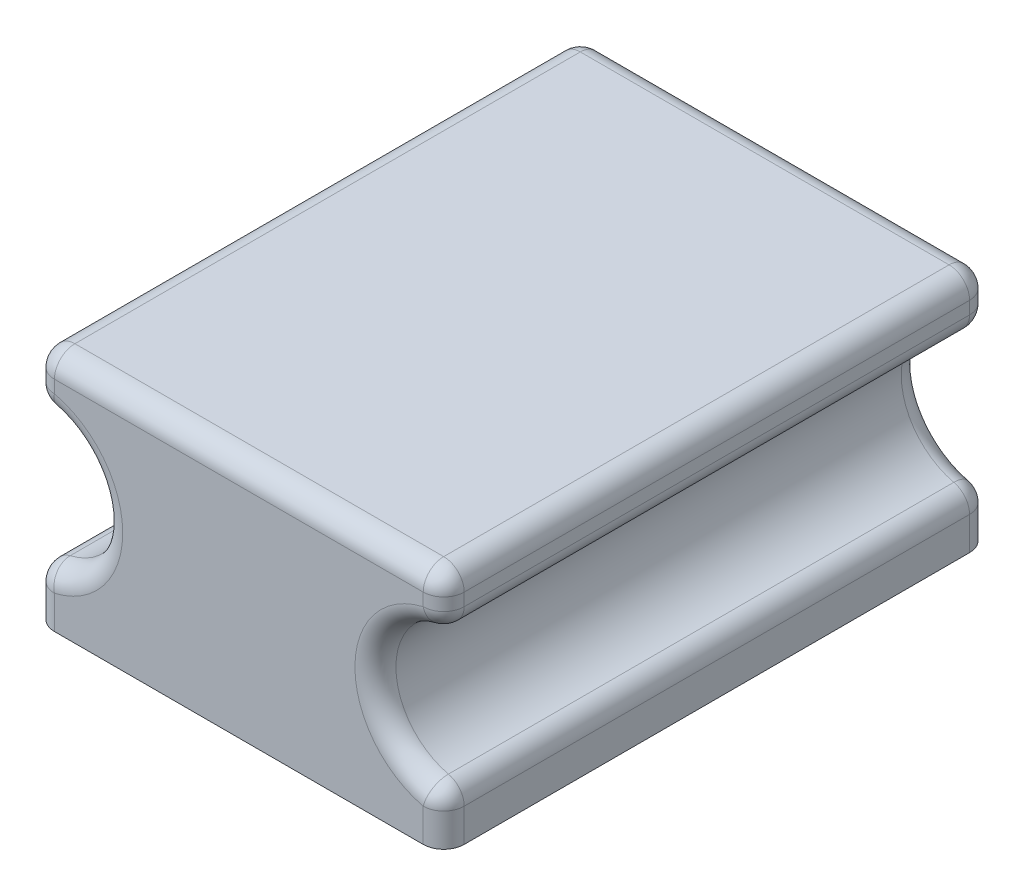
ISO-10303-21;
HEADER;
FILE_DESCRIPTION(('STEP AP214'),'2;1');
FILE_NAME('part.step','',(''),(''),'','','');
FILE_SCHEMA(('AUTOMOTIVE_DESIGN { 1 0 10303 214 1 1 1 1 }'));
ENDSEC;
DATA;
#1=APPLICATION_CONTEXT('core data for automotive mechanical design processes');
#2=APPLICATION_PROTOCOL_DEFINITION('international standard','automotive_design',2000,#1);
#3=PRODUCT_CONTEXT('',#1,'mechanical');
#4=PRODUCT('Part','Part','',(#3));
#5=PRODUCT_RELATED_PRODUCT_CATEGORY('part','',(#4));
#6=PRODUCT_DEFINITION_FORMATION('','',#4);
#7=PRODUCT_DEFINITION_CONTEXT('part definition',#1,'design');
#8=PRODUCT_DEFINITION('design','',#6,#7);
#9=PRODUCT_DEFINITION_SHAPE('','',#8);
#10=(LENGTH_UNIT() NAMED_UNIT(*) SI_UNIT(.MILLI.,.METRE.));
#11=(NAMED_UNIT(*) PLANE_ANGLE_UNIT() SI_UNIT($,.RADIAN.));
#12=(NAMED_UNIT(*) SI_UNIT($,.STERADIAN.) SOLID_ANGLE_UNIT());
#13=UNCERTAINTY_MEASURE_WITH_UNIT(LENGTH_MEASURE(1.E-05),#10,'distance_accuracy_value','');
#14=(GEOMETRIC_REPRESENTATION_CONTEXT(3) GLOBAL_UNCERTAINTY_ASSIGNED_CONTEXT((#13)) GLOBAL_UNIT_ASSIGNED_CONTEXT((#10,
#11,#12)) REPRESENTATION_CONTEXT('',''));
#15=CARTESIAN_POINT('',(0.,0.,0.));
#16=DIRECTION('',(0.,0.,1.));
#17=DIRECTION('',(1.,0.,0.));
#18=AXIS2_PLACEMENT_3D('',#15,#16,#17);
#19=CARTESIAN_POINT('',(-30.,7.5,40.));
#20=DIRECTION('',(1.,0.,0.));
#21=DIRECTION('',(0.,0.,-1.));
#22=AXIS2_PLACEMENT_3D('',#19,#20,#21);
#23=PLANE('',#22);
#24=DIRECTION('',(0.,0.,-1.));
#25=VECTOR('',#24,1.);
#26=CARTESIAN_POINT('',(-30.,4.85088935932648,40.));
#27=LINE('',#26,#25);
#28=CARTESIAN_POINT('',(-30.,4.85088935932648,37.));
#29=VERTEX_POINT('',#28);
#30=CARTESIAN_POINT('',(-30.,4.85088935932648,-37.));
#31=VERTEX_POINT('',#30);
#32=EDGE_CURVE('E224',#29,#31,#27,.T.);
#33=ORIENTED_EDGE('',*,*,#32,.T.);
#34=DIRECTION('',(0.,-1.,0.));
#35=VECTOR('',#34,1.);
#36=CARTESIAN_POINT('',(-30.,7.5,-37.));
#37=LINE('',#36,#35);
#38=CARTESIAN_POINT('',(-30.,0.,-37.));
#39=VERTEX_POINT('',#38);
#40=EDGE_CURVE('E296',#31,#39,#37,.T.);
#41=ORIENTED_EDGE('',*,*,#40,.T.);
#42=DIRECTION('',(0.,0.,-1.));
#43=VECTOR('',#42,1.);
#44=CARTESIAN_POINT('',(-30.,0.,40.));
#45=LINE('',#44,#43);
#46=CARTESIAN_POINT('',(-30.,0.,37.));
#47=VERTEX_POINT('',#46);
#48=EDGE_CURVE('E416',#47,#39,#45,.T.);
#49=ORIENTED_EDGE('',*,*,#48,.F.);
#50=DIRECTION('',(0.,-1.,0.));
#51=VECTOR('',#50,1.);
#52=CARTESIAN_POINT('',(-30.,4.85088935932648,37.));
#53=LINE('',#52,#51);
#54=EDGE_CURVE('E294',#47,#29,#53,.F.);
#55=ORIENTED_EDGE('',*,*,#54,.T.);
#56=EDGE_LOOP('',(#33,#41,#49,#55));
#57=FACE_BOUND('',#56,.T.);
#58=ADVANCED_FACE('F37',(#57),#23,.F.);
#59=CARTESIAN_POINT('',(-30.,0.,40.));
#60=DIRECTION('',(0.,1.,0.));
#61=DIRECTION('',(0.,0.,1.));
#62=AXIS2_PLACEMENT_3D('',#59,#60,#61);
#63=PLANE('',#62);
#64=DIRECTION('',(1.,0.,0.));
#65=VECTOR('',#64,1.);
#66=CARTESIAN_POINT('',(-30.,0.,-40.));
#67=LINE('',#66,#65);
#68=CARTESIAN_POINT('',(-27.,0.,-40.));
#69=VERTEX_POINT('',#68);
#70=CARTESIAN_POINT('',(27.,0.,-40.));
#71=VERTEX_POINT('',#70);
#72=EDGE_CURVE('E363',#69,#71,#67,.T.);
#73=ORIENTED_EDGE('',*,*,#72,.T.);
#74=CARTESIAN_POINT('',(27.,0.,-37.));
#75=DIRECTION('',(0.,1.,0.));
#76=DIRECTION('',(0.,0.,1.));
#77=AXIS2_PLACEMENT_3D('',#74,#75,#76);
#78=CIRCLE('',#77,3.);
#79=CARTESIAN_POINT('',(30.,0.,-37.));
#80=VERTEX_POINT('',#79);
#81=EDGE_CURVE('E276',#71,#80,#78,.F.);
#82=ORIENTED_EDGE('',*,*,#81,.T.);
#83=DIRECTION('',(0.,0.,-1.));
#84=VECTOR('',#83,1.);
#85=CARTESIAN_POINT('',(30.,0.,40.));
#86=LINE('',#85,#84);
#87=CARTESIAN_POINT('',(30.,0.,37.));
#88=VERTEX_POINT('',#87);
#89=EDGE_CURVE('E218',#88,#80,#86,.T.);
#90=ORIENTED_EDGE('',*,*,#89,.F.);
#91=CARTESIAN_POINT('',(27.,0.,37.));
#92=DIRECTION('',(0.,1.,0.));
#93=DIRECTION('',(0.,0.,1.));
#94=AXIS2_PLACEMENT_3D('',#91,#92,#93);
#95=CIRCLE('',#94,3.);
#96=CARTESIAN_POINT('',(27.,0.,40.));
#97=VERTEX_POINT('',#96);
#98=EDGE_CURVE('E272',#88,#97,#95,.F.);
#99=ORIENTED_EDGE('',*,*,#98,.T.);
#100=DIRECTION('',(1.,0.,0.));
#101=VECTOR('',#100,1.);
#102=CARTESIAN_POINT('',(-30.,0.,40.));
#103=LINE('',#102,#101);
#104=CARTESIAN_POINT('',(-27.,0.,40.));
#105=VERTEX_POINT('',#104);
#106=EDGE_CURVE('E408',#105,#97,#103,.T.);
#107=ORIENTED_EDGE('',*,*,#106,.F.);
#108=CARTESIAN_POINT('',(-27.,0.,37.));
#109=DIRECTION('',(0.,1.,0.));
#110=DIRECTION('',(0.,0.,1.));
#111=AXIS2_PLACEMENT_3D('',#108,#109,#110);
#112=CIRCLE('',#111,3.);
#113=EDGE_CURVE('E270',#105,#47,#112,.F.);
#114=ORIENTED_EDGE('',*,*,#113,.T.);
#115=ORIENTED_EDGE('',*,*,#48,.T.);
#116=CARTESIAN_POINT('',(-27.,0.,-37.));
#117=DIRECTION('',(0.,1.,0.));
#118=DIRECTION('',(0.,0.,1.));
#119=AXIS2_PLACEMENT_3D('',#116,#117,#118);
#120=CIRCLE('',#119,3.);
#121=EDGE_CURVE('E274',#39,#69,#120,.F.);
#122=ORIENTED_EDGE('',*,*,#121,.T.);
#123=EDGE_LOOP('',(#73,#82,#90,#99,#107,#114,#115,#122));
#124=FACE_BOUND('',#123,.T.);
#125=ADVANCED_FACE('F411',(#124),#63,.F.);
#126=CARTESIAN_POINT('',(30.,0.,40.));
#127=DIRECTION('',(-1.,0.,0.));
#128=DIRECTION('',(0.,0.,1.));
#129=AXIS2_PLACEMENT_3D('',#126,#127,#128);
#130=PLANE('',#129);
#131=ORIENTED_EDGE('',*,*,#89,.T.);
#132=DIRECTION('',(0.,1.,0.));
#133=VECTOR('',#132,1.);
#134=CARTESIAN_POINT('',(30.,0.,-37.));
#135=LINE('',#134,#133);
#136=CARTESIAN_POINT('',(30.,4.85088935932648,-37.));
#137=VERTEX_POINT('',#136);
#138=EDGE_CURVE('E196',#80,#137,#135,.T.);
#139=ORIENTED_EDGE('',*,*,#138,.T.);
#140=DIRECTION('',(0.,0.,-1.));
#141=VECTOR('',#140,1.);
#142=CARTESIAN_POINT('',(30.,4.85088935932648,40.));
#143=LINE('',#142,#141);
#144=CARTESIAN_POINT('',(30.,4.85088935932648,37.));
#145=VERTEX_POINT('',#144);
#146=EDGE_CURVE('E216',#137,#145,#143,.F.);
#147=ORIENTED_EDGE('',*,*,#146,.T.);
#148=DIRECTION('',(0.,1.,0.));
#149=VECTOR('',#148,1.);
#150=CARTESIAN_POINT('',(30.,0.,37.));
#151=LINE('',#150,#149);
#152=EDGE_CURVE('E220',#145,#88,#151,.F.);
#153=ORIENTED_EDGE('',*,*,#152,.T.);
#154=EDGE_LOOP('',(#131,#139,#147,#153));
#155=FACE_BOUND('',#154,.T.);
#156=ADVANCED_FACE('F215',(#155),#130,.F.);
#157=CARTESIAN_POINT('',(30.,17.5,40.));
#158=DIRECTION('',(0.,0.,-1.));
#159=DIRECTION('',(-1.,0.,0.));
#160=AXIS2_PLACEMENT_3D('',#157,#158,#159);
#161=CYLINDRICAL_SURFACE('',#160,10.);
#162=DIRECTION('',(0.,0.,-1.));
#163=VECTOR('',#162,1.);
#164=CARTESIAN_POINT('',(27.6923076923077,7.7699148917896,40.));
#165=LINE('',#164,#163);
#166=CARTESIAN_POINT('',(27.6923076923077,7.7699148917896,37.));
#167=VERTEX_POINT('',#166);
#168=CARTESIAN_POINT('',(27.6923076923077,7.7699148917896,-37.));
#169=VERTEX_POINT('',#168);
#170=EDGE_CURVE('E225',#167,#169,#165,.T.);
#171=ORIENTED_EDGE('',*,*,#170,.T.);
#172=CARTESIAN_POINT('',(30.,17.5,-37.));
#173=DIRECTION('',(0.,0.,1.));
#174=DIRECTION('',(1.,0.,0.));
#175=AXIS2_PLACEMENT_3D('',#172,#173,#174);
#176=CIRCLE('',#175,10.);
#177=CARTESIAN_POINT('',(27.6923076923077,27.2300851082104,-37.));
#178=VERTEX_POINT('',#177);
#179=EDGE_CURVE('E280',#169,#178,#176,.F.);
#180=ORIENTED_EDGE('',*,*,#179,.T.);
#181=DIRECTION('',(0.,0.,-1.));
#182=VECTOR('',#181,1.);
#183=CARTESIAN_POINT('',(27.6923076923077,27.2300851082104,40.));
#184=LINE('',#183,#182);
#185=CARTESIAN_POINT('',(27.6923076923077,27.2300851082104,37.));
#186=VERTEX_POINT('',#185);
#187=EDGE_CURVE('E230',#178,#186,#184,.F.);
#188=ORIENTED_EDGE('',*,*,#187,.T.);
#189=CARTESIAN_POINT('',(30.,17.5,37.));
#190=DIRECTION('',(0.,0.,1.));
#191=DIRECTION('',(1.,0.,0.));
#192=AXIS2_PLACEMENT_3D('',#189,#190,#191);
#193=CIRCLE('',#192,10.);
#194=EDGE_CURVE('E209',#186,#167,#193,.T.);
#195=ORIENTED_EDGE('',*,*,#194,.T.);
#196=EDGE_LOOP('',(#171,#180,#188,#195));
#197=FACE_BOUND('',#196,.T.);
#198=ADVANCED_FACE('F424',(#197),#161,.F.);
#199=CARTESIAN_POINT('',(30.,27.5,40.));
#200=DIRECTION('',(-1.,0.,0.));
#201=DIRECTION('',(0.,0.,1.));
#202=AXIS2_PLACEMENT_3D('',#199,#200,#201);
#203=PLANE('',#202);
#204=DIRECTION('',(0.,0.,-1.));
#205=VECTOR('',#204,1.);
#206=CARTESIAN_POINT('',(30.,30.1491106406735,40.));
#207=LINE('',#206,#205);
#208=CARTESIAN_POINT('',(30.,30.1491106406735,37.));
#209=VERTEX_POINT('',#208);
#210=CARTESIAN_POINT('',(30.,30.1491106406735,-37.));
#211=VERTEX_POINT('',#210);
#212=EDGE_CURVE('E248',#209,#211,#207,.T.);
#213=ORIENTED_EDGE('',*,*,#212,.T.);
#214=DIRECTION('',(0.,1.,0.));
#215=VECTOR('',#214,1.);
#216=CARTESIAN_POINT('',(30.,27.5,-37.));
#217=LINE('',#216,#215);
#218=CARTESIAN_POINT('',(30.,32.,-37.));
#219=VERTEX_POINT('',#218);
#220=EDGE_CURVE('E288',#211,#219,#217,.T.);
#221=ORIENTED_EDGE('',*,*,#220,.T.);
#222=DIRECTION('',(0.,0.,-1.));
#223=VECTOR('',#222,1.);
#224=CARTESIAN_POINT('',(30.,32.,40.));
#225=LINE('',#224,#223);
#226=CARTESIAN_POINT('',(30.,32.,37.));
#227=VERTEX_POINT('',#226);
#228=EDGE_CURVE('E245',#219,#227,#225,.F.);
#229=ORIENTED_EDGE('',*,*,#228,.T.);
#230=DIRECTION('',(0.,1.,0.));
#231=VECTOR('',#230,1.);
#232=CARTESIAN_POINT('',(30.,30.1491106406735,37.));
#233=LINE('',#232,#231);
#234=EDGE_CURVE('E286',#227,#209,#233,.F.);
#235=ORIENTED_EDGE('',*,*,#234,.T.);
#236=EDGE_LOOP('',(#213,#221,#229,#235));
#237=FACE_BOUND('',#236,.T.);
#238=ADVANCED_FACE('F541',(#237),#203,.F.);
#239=CARTESIAN_POINT('',(30.,35.,40.));
#240=DIRECTION('',(0.,-1.,0.));
#241=DIRECTION('',(0.,0.,-1.));
#242=AXIS2_PLACEMENT_3D('',#239,#240,#241);
#243=PLANE('',#242);
#244=DIRECTION('',(0.,0.,-1.));
#245=VECTOR('',#244,1.);
#246=CARTESIAN_POINT('',(27.,35.,40.));
#247=LINE('',#246,#245);
#248=CARTESIAN_POINT('',(27.,35.,37.));
#249=VERTEX_POINT('',#248);
#250=CARTESIAN_POINT('',(27.,35.,-37.));
#251=VERTEX_POINT('',#250);
#252=EDGE_CURVE('E251',#249,#251,#247,.T.);
#253=ORIENTED_EDGE('',*,*,#252,.T.);
#254=DIRECTION('',(-1.,0.,0.));
#255=VECTOR('',#254,1.);
#256=CARTESIAN_POINT('',(30.,35.,-37.));
#257=LINE('',#256,#255);
#258=CARTESIAN_POINT('',(-27.,35.,-37.));
#259=VERTEX_POINT('',#258);
#260=EDGE_CURVE('E11',#251,#259,#257,.T.);
#261=ORIENTED_EDGE('',*,*,#260,.T.);
#262=DIRECTION('',(0.,0.,-1.));
#263=VECTOR('',#262,1.);
#264=CARTESIAN_POINT('',(-27.,35.,40.));
#265=LINE('',#264,#263);
#266=CARTESIAN_POINT('',(-27.,35.,37.));
#267=VERTEX_POINT('',#266);
#268=EDGE_CURVE('E254',#259,#267,#265,.F.);
#269=ORIENTED_EDGE('',*,*,#268,.T.);
#270=DIRECTION('',(-1.,0.,0.));
#271=VECTOR('',#270,1.);
#272=CARTESIAN_POINT('',(27.,35.,37.));
#273=LINE('',#272,#271);
#274=EDGE_CURVE('E46',#267,#249,#273,.F.);
#275=ORIENTED_EDGE('',*,*,#274,.T.);
#276=EDGE_LOOP('',(#253,#261,#269,#275));
#277=FACE_BOUND('',#276,.T.);
#278=ADVANCED_FACE('F551',(#277),#243,.F.);
#279=CARTESIAN_POINT('',(-30.,35.,40.));
#280=DIRECTION('',(1.,0.,0.));
#281=DIRECTION('',(0.,0.,-1.));
#282=AXIS2_PLACEMENT_3D('',#279,#280,#281);
#283=PLANE('',#282);
#284=DIRECTION('',(0.,0.,-1.));
#285=VECTOR('',#284,1.);
#286=CARTESIAN_POINT('',(-30.,32.,40.));
#287=LINE('',#286,#285);
#288=CARTESIAN_POINT('',(-30.,32.,37.));
#289=VERTEX_POINT('',#288);
#290=CARTESIAN_POINT('',(-30.,32.,-37.));
#291=VERTEX_POINT('',#290);
#292=EDGE_CURVE('E239',#289,#291,#287,.T.);
#293=ORIENTED_EDGE('',*,*,#292,.T.);
#294=DIRECTION('',(0.,-1.,0.));
#295=VECTOR('',#294,1.);
#296=CARTESIAN_POINT('',(-30.,35.,-37.));
#297=LINE('',#296,#295);
#298=CARTESIAN_POINT('',(-30.,30.1491106406735,-37.));
#299=VERTEX_POINT('',#298);
#300=EDGE_CURVE('E312',#291,#299,#297,.T.);
#301=ORIENTED_EDGE('',*,*,#300,.T.);
#302=DIRECTION('',(0.,0.,-1.));
#303=VECTOR('',#302,1.);
#304=CARTESIAN_POINT('',(-30.,30.1491106406735,40.));
#305=LINE('',#304,#303);
#306=CARTESIAN_POINT('',(-30.,30.1491106406735,37.));
#307=VERTEX_POINT('',#306);
#308=EDGE_CURVE('E242',#299,#307,#305,.F.);
#309=ORIENTED_EDGE('',*,*,#308,.T.);
#310=DIRECTION('',(0.,-1.,0.));
#311=VECTOR('',#310,1.);
#312=CARTESIAN_POINT('',(-30.,32.,37.));
#313=LINE('',#312,#311);
#314=EDGE_CURVE('E310',#307,#289,#313,.F.);
#315=ORIENTED_EDGE('',*,*,#314,.T.);
#316=EDGE_LOOP('',(#293,#301,#309,#315));
#317=FACE_BOUND('',#316,.T.);
#318=ADVANCED_FACE('F562',(#317),#283,.F.);
#319=CARTESIAN_POINT('',(-30.,17.5,40.));
#320=DIRECTION('',(0.,0.,-1.));
#321=DIRECTION('',(-1.,0.,0.));
#322=AXIS2_PLACEMENT_3D('',#319,#320,#321);
#323=CYLINDRICAL_SURFACE('',#322,10.);
#324=DIRECTION('',(0.,0.,-1.));
#325=VECTOR('',#324,1.);
#326=CARTESIAN_POINT('',(-27.6923076923077,27.2300851082104,40.));
#327=LINE('',#326,#325);
#328=CARTESIAN_POINT('',(-27.6923076923077,27.2300851082104,37.));
#329=VERTEX_POINT('',#328);
#330=CARTESIAN_POINT('',(-27.6923076923077,27.2300851082104,-37.));
#331=VERTEX_POINT('',#330);
#332=EDGE_CURVE('E228',#329,#331,#327,.T.);
#333=ORIENTED_EDGE('',*,*,#332,.T.);
#334=CARTESIAN_POINT('',(-30.,17.5,-37.));
#335=DIRECTION('',(0.,0.,1.));
#336=DIRECTION('',(1.,0.,0.));
#337=AXIS2_PLACEMENT_3D('',#334,#335,#336);
#338=CIRCLE('',#337,10.);
#339=CARTESIAN_POINT('',(-27.6923076923077,7.7699148917896,-37.));
#340=VERTEX_POINT('',#339);
#341=EDGE_CURVE('E304',#331,#340,#338,.F.);
#342=ORIENTED_EDGE('',*,*,#341,.T.);
#343=DIRECTION('',(0.,0.,-1.));
#344=VECTOR('',#343,1.);
#345=CARTESIAN_POINT('',(-27.6923076923077,7.7699148917896,40.));
#346=LINE('',#345,#344);
#347=CARTESIAN_POINT('',(-27.6923076923077,7.7699148917896,37.));
#348=VERTEX_POINT('',#347);
#349=EDGE_CURVE('E236',#340,#348,#346,.F.);
#350=ORIENTED_EDGE('',*,*,#349,.T.);
#351=CARTESIAN_POINT('',(-30.,17.5,37.));
#352=DIRECTION('',(0.,0.,1.));
#353=DIRECTION('',(1.,0.,0.));
#354=AXIS2_PLACEMENT_3D('',#351,#352,#353);
#355=CIRCLE('',#354,10.);
#356=EDGE_CURVE('E302',#348,#329,#355,.T.);
#357=ORIENTED_EDGE('',*,*,#356,.T.);
#358=EDGE_LOOP('',(#333,#342,#350,#357));
#359=FACE_BOUND('',#358,.T.);
#360=ADVANCED_FACE('F573',(#359),#323,.F.);
#361=CARTESIAN_POINT('',(30.,17.5,40.));
#362=DIRECTION('',(0.,0.,1.));
#363=DIRECTION('',(1.,0.,0.));
#364=AXIS2_PLACEMENT_3D('',#361,#362,#363);
#365=PLANE('',#364);
#366=ORIENTED_EDGE('',*,*,#106,.T.);
#367=DIRECTION('',(0.,1.,0.));
#368=VECTOR('',#367,1.);
#369=CARTESIAN_POINT('',(27.,4.85088935932648,40.));
#370=LINE('',#369,#368);
#371=CARTESIAN_POINT('',(27.,4.85088935932648,40.));
#372=VERTEX_POINT('',#371);
#373=EDGE_CURVE('E329',#97,#372,#370,.T.);
#374=ORIENTED_EDGE('',*,*,#373,.T.);
#375=CARTESIAN_POINT('',(30.,17.5,40.));
#376=DIRECTION('',(0.,0.,1.));
#377=DIRECTION('',(1.,0.,0.));
#378=AXIS2_PLACEMENT_3D('',#375,#376,#377);
#379=CIRCLE('',#378,13.);
#380=CARTESIAN_POINT('',(27.,30.1491106406735,40.));
#381=VERTEX_POINT('',#380);
#382=EDGE_CURVE('E62',#372,#381,#379,.F.);
#383=ORIENTED_EDGE('',*,*,#382,.T.);
#384=DIRECTION('',(0.,1.,0.));
#385=VECTOR('',#384,1.);
#386=CARTESIAN_POINT('',(27.,32.,40.));
#387=LINE('',#386,#385);
#388=CARTESIAN_POINT('',(27.,32.,40.));
#389=VERTEX_POINT('',#388);
#390=EDGE_CURVE('E326',#381,#389,#387,.T.);
#391=ORIENTED_EDGE('',*,*,#390,.T.);
#392=DIRECTION('',(-1.,0.,0.));
#393=VECTOR('',#392,1.);
#394=CARTESIAN_POINT('',(-27.,32.,40.));
#395=LINE('',#394,#393);
#396=CARTESIAN_POINT('',(-27.,32.,40.));
#397=VERTEX_POINT('',#396);
#398=EDGE_CURVE('E318',#389,#397,#395,.T.);
#399=ORIENTED_EDGE('',*,*,#398,.T.);
#400=DIRECTION('',(0.,-1.,0.));
#401=VECTOR('',#400,1.);
#402=CARTESIAN_POINT('',(-27.,30.1491106406735,40.));
#403=LINE('',#402,#401);
#404=CARTESIAN_POINT('',(-27.,30.1491106406735,40.));
#405=VERTEX_POINT('',#404);
#406=EDGE_CURVE('E320',#397,#405,#403,.T.);
#407=ORIENTED_EDGE('',*,*,#406,.T.);
#408=CARTESIAN_POINT('',(-30.,17.5,40.));
#409=DIRECTION('',(0.,0.,1.));
#410=DIRECTION('',(1.,0.,0.));
#411=AXIS2_PLACEMENT_3D('',#408,#409,#410);
#412=CIRCLE('',#411,13.);
#413=CARTESIAN_POINT('',(-27.,4.85088935932648,40.));
#414=VERTEX_POINT('',#413);
#415=EDGE_CURVE('E322',#405,#414,#412,.F.);
#416=ORIENTED_EDGE('',*,*,#415,.T.);
#417=DIRECTION('',(0.,-1.,0.));
#418=VECTOR('',#417,1.);
#419=CARTESIAN_POINT('',(-27.,0.,40.));
#420=LINE('',#419,#418);
#421=EDGE_CURVE('E324',#414,#105,#420,.T.);
#422=ORIENTED_EDGE('',*,*,#421,.T.);
#423=EDGE_LOOP('',(#366,#374,#383,#391,#399,#407,#416,#422));
#424=FACE_BOUND('',#423,.T.);
#425=ADVANCED_FACE('F407',(#424),#365,.T.);
#426=CARTESIAN_POINT('',(30.,17.5,-40.));
#427=DIRECTION('',(0.,0.,1.));
#428=DIRECTION('',(1.,0.,0.));
#429=AXIS2_PLACEMENT_3D('',#426,#427,#428);
#430=PLANE('',#429);
#431=CARTESIAN_POINT('',(30.,17.5,-40.));
#432=DIRECTION('',(0.,0.,1.));
#433=DIRECTION('',(1.,0.,0.));
#434=AXIS2_PLACEMENT_3D('',#431,#432,#433);
#435=CIRCLE('',#434,13.);
#436=CARTESIAN_POINT('',(27.,30.1491106406735,-40.));
#437=VERTEX_POINT('',#436);
#438=CARTESIAN_POINT('',(27.,4.85088935932648,-40.));
#439=VERTEX_POINT('',#438);
#440=EDGE_CURVE('E267',#437,#439,#435,.T.);
#441=ORIENTED_EDGE('',*,*,#440,.T.);
#442=DIRECTION('',(0.,1.,0.));
#443=VECTOR('',#442,1.);
#444=CARTESIAN_POINT('',(27.,17.5,-40.));
#445=LINE('',#444,#443);
#446=EDGE_CURVE('E197',#439,#71,#445,.F.);
#447=ORIENTED_EDGE('',*,*,#446,.T.);
#448=ORIENTED_EDGE('',*,*,#72,.F.);
#449=DIRECTION('',(0.,-1.,0.));
#450=VECTOR('',#449,1.);
#451=CARTESIAN_POINT('',(-27.,17.5,-40.));
#452=LINE('',#451,#450);
#453=CARTESIAN_POINT('',(-27.,4.85088935932648,-40.));
#454=VERTEX_POINT('',#453);
#455=EDGE_CURVE('E263',#69,#454,#452,.F.);
#456=ORIENTED_EDGE('',*,*,#455,.T.);
#457=CARTESIAN_POINT('',(-30.,17.5,-40.));
#458=DIRECTION('',(0.,0.,1.));
#459=DIRECTION('',(1.,0.,0.));
#460=AXIS2_PLACEMENT_3D('',#457,#458,#459);
#461=CIRCLE('',#460,13.);
#462=CARTESIAN_POINT('',(-27.,30.1491106406735,-40.));
#463=VERTEX_POINT('',#462);
#464=EDGE_CURVE('E261',#454,#463,#461,.T.);
#465=ORIENTED_EDGE('',*,*,#464,.T.);
#466=DIRECTION('',(0.,-1.,0.));
#467=VECTOR('',#466,1.);
#468=CARTESIAN_POINT('',(-27.,17.5,-40.));
#469=LINE('',#468,#467);
#470=CARTESIAN_POINT('',(-27.,32.,-40.));
#471=VERTEX_POINT('',#470);
#472=EDGE_CURVE('E259',#463,#471,#469,.F.);
#473=ORIENTED_EDGE('',*,*,#472,.T.);
#474=DIRECTION('',(-1.,0.,0.));
#475=VECTOR('',#474,1.);
#476=CARTESIAN_POINT('',(30.,32.,-40.));
#477=LINE('',#476,#475);
#478=CARTESIAN_POINT('',(27.,32.,-40.));
#479=VERTEX_POINT('',#478);
#480=EDGE_CURVE('E219',#471,#479,#477,.F.);
#481=ORIENTED_EDGE('',*,*,#480,.T.);
#482=DIRECTION('',(0.,1.,0.));
#483=VECTOR('',#482,1.);
#484=CARTESIAN_POINT('',(27.,17.5,-40.));
#485=LINE('',#484,#483);
#486=EDGE_CURVE('E265',#479,#437,#485,.F.);
#487=ORIENTED_EDGE('',*,*,#486,.T.);
#488=EDGE_LOOP('',(#441,#447,#448,#456,#465,#473,#481,#487));
#489=FACE_BOUND('',#488,.T.);
#490=ADVANCED_FACE('F459',(#489),#430,.F.);
#491=CARTESIAN_POINT('',(27.,4.85088935932648,40.));
#492=DIRECTION('',(0.,0.,-1.));
#493=DIRECTION('',(-1.,0.,0.));
#494=AXIS2_PLACEMENT_3D('',#491,#492,#493);
#495=CYLINDRICAL_SURFACE('',#494,3.);
#496=ORIENTED_EDGE('',*,*,#146,.F.);
#497=CARTESIAN_POINT('',(27.,4.85088935932648,-37.));
#498=DIRECTION('',(0.,0.,-1.));
#499=DIRECTION('',(-1.,0.,0.));
#500=AXIS2_PLACEMENT_3D('',#497,#498,#499);
#501=CIRCLE('',#500,3.);
#502=EDGE_CURVE('E202',#137,#169,#501,.F.);
#503=ORIENTED_EDGE('',*,*,#502,.T.);
#504=ORIENTED_EDGE('',*,*,#170,.F.);
#505=CARTESIAN_POINT('',(27.,4.85088935932648,37.));
#506=DIRECTION('',(0.,0.,-1.));
#507=DIRECTION('',(-1.,0.,0.));
#508=AXIS2_PLACEMENT_3D('',#505,#506,#507);
#509=CIRCLE('',#508,3.);
#510=EDGE_CURVE('E210',#167,#145,#509,.T.);
#511=ORIENTED_EDGE('',*,*,#510,.T.);
#512=EDGE_LOOP('',(#496,#503,#504,#511));
#513=FACE_BOUND('',#512,.T.);
#514=ADVANCED_FACE('F222',(#513),#495,.T.);
#515=CARTESIAN_POINT('',(-27.,4.85088935932648,40.));
#516=DIRECTION('',(0.,0.,-1.));
#517=DIRECTION('',(-1.,0.,0.));
#518=AXIS2_PLACEMENT_3D('',#515,#516,#517);
#519=CYLINDRICAL_SURFACE('',#518,3.);
#520=ORIENTED_EDGE('',*,*,#349,.F.);
#521=CARTESIAN_POINT('',(-27.,4.85088935932648,-37.));
#522=DIRECTION('',(0.,0.,-1.));
#523=DIRECTION('',(-1.,0.,0.));
#524=AXIS2_PLACEMENT_3D('',#521,#522,#523);
#525=CIRCLE('',#524,3.);
#526=EDGE_CURVE('E300',#340,#31,#525,.F.);
#527=ORIENTED_EDGE('',*,*,#526,.T.);
#528=ORIENTED_EDGE('',*,*,#32,.F.);
#529=CARTESIAN_POINT('',(-27.,4.85088935932648,37.));
#530=DIRECTION('',(0.,0.,-1.));
#531=DIRECTION('',(-1.,0.,0.));
#532=AXIS2_PLACEMENT_3D('',#529,#530,#531);
#533=CIRCLE('',#532,3.);
#534=EDGE_CURVE('E298',#29,#348,#533,.T.);
#535=ORIENTED_EDGE('',*,*,#534,.T.);
#536=EDGE_LOOP('',(#520,#527,#528,#535));
#537=FACE_BOUND('',#536,.T.);
#538=ADVANCED_FACE('F458',(#537),#519,.T.);
#539=CARTESIAN_POINT('',(-27.,30.1491106406735,40.));
#540=DIRECTION('',(0.,0.,-1.));
#541=DIRECTION('',(-1.,0.,0.));
#542=AXIS2_PLACEMENT_3D('',#539,#540,#541);
#543=CYLINDRICAL_SURFACE('',#542,3.);
#544=ORIENTED_EDGE('',*,*,#308,.F.);
#545=CARTESIAN_POINT('',(-27.,30.1491106406735,-37.));
#546=DIRECTION('',(0.,0.,-1.));
#547=DIRECTION('',(-1.,0.,0.));
#548=AXIS2_PLACEMENT_3D('',#545,#546,#547);
#549=CIRCLE('',#548,3.);
#550=EDGE_CURVE('E308',#299,#331,#549,.F.);
#551=ORIENTED_EDGE('',*,*,#550,.T.);
#552=ORIENTED_EDGE('',*,*,#332,.F.);
#553=CARTESIAN_POINT('',(-27.,30.1491106406735,37.));
#554=DIRECTION('',(0.,0.,-1.));
#555=DIRECTION('',(-1.,0.,0.));
#556=AXIS2_PLACEMENT_3D('',#553,#554,#555);
#557=CIRCLE('',#556,3.);
#558=EDGE_CURVE('E306',#329,#307,#557,.T.);
#559=ORIENTED_EDGE('',*,*,#558,.T.);
#560=EDGE_LOOP('',(#544,#551,#552,#559));
#561=FACE_BOUND('',#560,.T.);
#562=ADVANCED_FACE('F462',(#561),#543,.T.);
#563=CARTESIAN_POINT('',(27.,30.1491106406735,40.));
#564=DIRECTION('',(0.,0.,-1.));
#565=DIRECTION('',(-1.,0.,0.));
#566=AXIS2_PLACEMENT_3D('',#563,#564,#565);
#567=CYLINDRICAL_SURFACE('',#566,3.);
#568=ORIENTED_EDGE('',*,*,#187,.F.);
#569=CARTESIAN_POINT('',(27.,30.1491106406735,-37.));
#570=DIRECTION('',(0.,0.,-1.));
#571=DIRECTION('',(-1.,0.,0.));
#572=AXIS2_PLACEMENT_3D('',#569,#570,#571);
#573=CIRCLE('',#572,3.);
#574=EDGE_CURVE('E284',#178,#211,#573,.F.);
#575=ORIENTED_EDGE('',*,*,#574,.T.);
#576=ORIENTED_EDGE('',*,*,#212,.F.);
#577=CARTESIAN_POINT('',(27.,30.1491106406735,37.));
#578=DIRECTION('',(0.,0.,-1.));
#579=DIRECTION('',(-1.,0.,0.));
#580=AXIS2_PLACEMENT_3D('',#577,#578,#579);
#581=CIRCLE('',#580,3.);
#582=EDGE_CURVE('E282',#209,#186,#581,.T.);
#583=ORIENTED_EDGE('',*,*,#582,.T.);
#584=EDGE_LOOP('',(#568,#575,#576,#583));
#585=FACE_BOUND('',#584,.T.);
#586=ADVANCED_FACE('F466',(#585),#567,.T.);
#587=CARTESIAN_POINT('',(-27.,32.,40.));
#588=DIRECTION('',(0.,0.,-1.));
#589=DIRECTION('',(-1.,0.,0.));
#590=AXIS2_PLACEMENT_3D('',#587,#588,#589);
#591=CYLINDRICAL_SURFACE('',#590,3.);
#592=ORIENTED_EDGE('',*,*,#268,.F.);
#593=CARTESIAN_POINT('',(-27.,32.,-37.));
#594=DIRECTION('',(0.,0.,-1.));
#595=DIRECTION('',(-1.,0.,0.));
#596=AXIS2_PLACEMENT_3D('',#593,#594,#595);
#597=CIRCLE('',#596,3.);
#598=EDGE_CURVE('E316',#259,#291,#597,.F.);
#599=ORIENTED_EDGE('',*,*,#598,.T.);
#600=ORIENTED_EDGE('',*,*,#292,.F.);
#601=CARTESIAN_POINT('',(-27.,32.,37.));
#602=DIRECTION('',(0.,0.,-1.));
#603=DIRECTION('',(-1.,0.,0.));
#604=AXIS2_PLACEMENT_3D('',#601,#602,#603);
#605=CIRCLE('',#604,3.);
#606=EDGE_CURVE('E314',#289,#267,#605,.T.);
#607=ORIENTED_EDGE('',*,*,#606,.T.);
#608=EDGE_LOOP('',(#592,#599,#600,#607));
#609=FACE_BOUND('',#608,.T.);
#610=ADVANCED_FACE('F470',(#609),#591,.T.);
#611=CARTESIAN_POINT('',(27.,32.,40.));
#612=DIRECTION('',(0.,0.,-1.));
#613=DIRECTION('',(-1.,0.,0.));
#614=AXIS2_PLACEMENT_3D('',#611,#612,#613);
#615=CYLINDRICAL_SURFACE('',#614,3.);
#616=ORIENTED_EDGE('',*,*,#228,.F.);
#617=CARTESIAN_POINT('',(27.,32.,-37.));
#618=DIRECTION('',(0.,0.,-1.));
#619=DIRECTION('',(-1.,0.,0.));
#620=AXIS2_PLACEMENT_3D('',#617,#618,#619);
#621=CIRCLE('',#620,3.);
#622=EDGE_CURVE('E292',#219,#251,#621,.F.);
#623=ORIENTED_EDGE('',*,*,#622,.T.);
#624=ORIENTED_EDGE('',*,*,#252,.F.);
#625=CARTESIAN_POINT('',(27.,32.,37.));
#626=DIRECTION('',(0.,0.,-1.));
#627=DIRECTION('',(-1.,0.,0.));
#628=AXIS2_PLACEMENT_3D('',#625,#626,#627);
#629=CIRCLE('',#628,3.);
#630=EDGE_CURVE('E290',#249,#227,#629,.T.);
#631=ORIENTED_EDGE('',*,*,#630,.T.);
#632=EDGE_LOOP('',(#616,#623,#624,#631));
#633=FACE_BOUND('',#632,.T.);
#634=ADVANCED_FACE('F473',(#633),#615,.T.);
#635=CARTESIAN_POINT('',(-27.,7.5,-37.));
#636=DIRECTION('',(0.,-1.,0.));
#637=DIRECTION('',(0.,0.,-1.));
#638=AXIS2_PLACEMENT_3D('',#635,#636,#637);
#639=CYLINDRICAL_SURFACE('',#638,3.);
#640=ORIENTED_EDGE('',*,*,#121,.F.);
#641=ORIENTED_EDGE('',*,*,#40,.F.);
#642=CARTESIAN_POINT('',(-27.,4.85088935932648,-37.));
#643=DIRECTION('',(0.,1.,0.));
#644=DIRECTION('',(0.,0.,1.));
#645=AXIS2_PLACEMENT_3D('',#642,#643,#644);
#646=CIRCLE('',#645,3.);
#647=EDGE_CURVE('E360',#454,#31,#646,.T.);
#648=ORIENTED_EDGE('',*,*,#647,.F.);
#649=ORIENTED_EDGE('',*,*,#455,.F.);
#650=EDGE_LOOP('',(#640,#641,#648,#649));
#651=FACE_BOUND('',#650,.T.);
#652=ADVANCED_FACE('F477',(#651),#639,.T.);
#653=CARTESIAN_POINT('',(-27.,4.85088935932648,-37.));
#654=DIRECTION('',(0.,0.,1.));
#655=DIRECTION('',(1.,0.,0.));
#656=AXIS2_PLACEMENT_3D('',#653,#654,#655);
#657=SPHERICAL_SURFACE('',#656,3.);
#658=ORIENTED_EDGE('',*,*,#647,.T.);
#659=ORIENTED_EDGE('',*,*,#526,.F.);
#660=CARTESIAN_POINT('',(-27.,4.85088935932648,-37.));
#661=DIRECTION('',(0.97300851082104,0.230769230769231,0.));
#662=DIRECTION('',(-0.230769230769231,0.97300851082104,0.));
#663=AXIS2_PLACEMENT_3D('',#660,#661,#662);
#664=CIRCLE('',#663,3.);
#665=EDGE_CURVE('E357',#454,#340,#664,.T.);
#666=ORIENTED_EDGE('',*,*,#665,.F.);
#667=EDGE_LOOP('',(#658,#659,#666));
#668=FACE_BOUND('',#667,.T.);
#669=ADVANCED_FACE('F518',(#668),#657,.T.);
#670=CARTESIAN_POINT('',(-30.,17.5,-37.));
#671=DIRECTION('',(0.,0.,1.));
#672=DIRECTION('',(1.,0.,0.));
#673=AXIS2_PLACEMENT_3D('',#670,#671,#672);
#674=TOROIDAL_SURFACE('',#673,13.,3.);
#675=ORIENTED_EDGE('',*,*,#665,.T.);
#676=ORIENTED_EDGE('',*,*,#341,.F.);
#677=CARTESIAN_POINT('',(-27.,30.1491106406735,-37.));
#678=DIRECTION('',(-0.97300851082104,0.23076923076923,0.));
#679=DIRECTION('',(-0.23076923076923,-0.97300851082104,0.));
#680=AXIS2_PLACEMENT_3D('',#677,#678,#679);
#681=CIRCLE('',#680,3.);
#682=EDGE_CURVE('E354',#463,#331,#681,.T.);
#683=ORIENTED_EDGE('',*,*,#682,.F.);
#684=ORIENTED_EDGE('',*,*,#464,.F.);
#685=EDGE_LOOP('',(#675,#676,#683,#684));
#686=FACE_BOUND('',#685,.T.);
#687=ADVANCED_FACE('F514',(#686),#674,.T.);
#688=CARTESIAN_POINT('',(-27.,30.1491106406735,-37.));
#689=DIRECTION('',(0.,0.,1.));
#690=DIRECTION('',(1.,0.,0.));
#691=AXIS2_PLACEMENT_3D('',#688,#689,#690);
#692=SPHERICAL_SURFACE('',#691,3.);
#693=ORIENTED_EDGE('',*,*,#682,.T.);
#694=ORIENTED_EDGE('',*,*,#550,.F.);
#695=CARTESIAN_POINT('',(-27.,30.1491106406735,-37.));
#696=DIRECTION('',(0.,1.,0.));
#697=DIRECTION('',(0.,0.,1.));
#698=AXIS2_PLACEMENT_3D('',#695,#696,#697);
#699=CIRCLE('',#698,3.);
#700=EDGE_CURVE('E351',#463,#299,#699,.T.);
#701=ORIENTED_EDGE('',*,*,#700,.F.);
#702=EDGE_LOOP('',(#693,#694,#701));
#703=FACE_BOUND('',#702,.T.);
#704=ADVANCED_FACE('F510',(#703),#692,.T.);
#705=CARTESIAN_POINT('',(-27.,35.,-37.));
#706=DIRECTION('',(0.,-1.,0.));
#707=DIRECTION('',(0.,0.,-1.));
#708=AXIS2_PLACEMENT_3D('',#705,#706,#707);
#709=CYLINDRICAL_SURFACE('',#708,3.);
#710=ORIENTED_EDGE('',*,*,#700,.T.);
#711=ORIENTED_EDGE('',*,*,#300,.F.);
#712=CARTESIAN_POINT('',(-27.,32.,-37.));
#713=DIRECTION('',(0.,1.,0.));
#714=DIRECTION('',(0.,0.,1.));
#715=AXIS2_PLACEMENT_3D('',#712,#713,#714);
#716=CIRCLE('',#715,3.);
#717=EDGE_CURVE('E348',#471,#291,#716,.T.);
#718=ORIENTED_EDGE('',*,*,#717,.F.);
#719=ORIENTED_EDGE('',*,*,#472,.F.);
#720=EDGE_LOOP('',(#710,#711,#718,#719));
#721=FACE_BOUND('',#720,.T.);
#722=ADVANCED_FACE('F506',(#721),#709,.T.);
#723=CARTESIAN_POINT('',(-27.,32.,-37.));
#724=DIRECTION('',(0.,0.,1.));
#725=DIRECTION('',(1.,0.,0.));
#726=AXIS2_PLACEMENT_3D('',#723,#724,#725);
#727=SPHERICAL_SURFACE('',#726,3.);
#728=ORIENTED_EDGE('',*,*,#717,.T.);
#729=ORIENTED_EDGE('',*,*,#598,.F.);
#730=CARTESIAN_POINT('',(-27.,32.,-37.));
#731=DIRECTION('',(1.,0.,0.));
#732=DIRECTION('',(0.,1.,0.));
#733=AXIS2_PLACEMENT_3D('',#730,#731,#732);
#734=CIRCLE('',#733,3.);
#735=EDGE_CURVE('E345',#471,#259,#734,.T.);
#736=ORIENTED_EDGE('',*,*,#735,.F.);
#737=EDGE_LOOP('',(#728,#729,#736));
#738=FACE_BOUND('',#737,.T.);
#739=ADVANCED_FACE('F502',(#738),#727,.T.);
#740=CARTESIAN_POINT('',(30.,32.,-37.));
#741=DIRECTION('',(-1.,0.,0.));
#742=DIRECTION('',(0.,0.,1.));
#743=AXIS2_PLACEMENT_3D('',#740,#741,#742);
#744=CYLINDRICAL_SURFACE('',#743,3.);
#745=ORIENTED_EDGE('',*,*,#735,.T.);
#746=ORIENTED_EDGE('',*,*,#260,.F.);
#747=CARTESIAN_POINT('',(27.,32.,-37.));
#748=DIRECTION('',(1.,0.,0.));
#749=DIRECTION('',(0.,0.,-1.));
#750=AXIS2_PLACEMENT_3D('',#747,#748,#749);
#751=CIRCLE('',#750,3.);
#752=EDGE_CURVE('E342',#479,#251,#751,.T.);
#753=ORIENTED_EDGE('',*,*,#752,.F.);
#754=ORIENTED_EDGE('',*,*,#480,.F.);
#755=EDGE_LOOP('',(#745,#746,#753,#754));
#756=FACE_BOUND('',#755,.T.);
#757=ADVANCED_FACE('F498',(#756),#744,.T.);
#758=CARTESIAN_POINT('',(27.,32.,-37.));
#759=DIRECTION('',(0.,0.,1.));
#760=DIRECTION('',(1.,0.,0.));
#761=AXIS2_PLACEMENT_3D('',#758,#759,#760);
#762=SPHERICAL_SURFACE('',#761,3.);
#763=ORIENTED_EDGE('',*,*,#752,.T.);
#764=ORIENTED_EDGE('',*,*,#622,.F.);
#765=CARTESIAN_POINT('',(27.,32.,-37.));
#766=DIRECTION('',(0.,-1.,0.));
#767=DIRECTION('',(0.,0.,-1.));
#768=AXIS2_PLACEMENT_3D('',#765,#766,#767);
#769=CIRCLE('',#768,3.);
#770=EDGE_CURVE('E339',#479,#219,#769,.T.);
#771=ORIENTED_EDGE('',*,*,#770,.F.);
#772=EDGE_LOOP('',(#763,#764,#771));
#773=FACE_BOUND('',#772,.T.);
#774=ADVANCED_FACE('F494',(#773),#762,.T.);
#775=CARTESIAN_POINT('',(27.,27.5,-37.));
#776=DIRECTION('',(0.,1.,0.));
#777=DIRECTION('',(0.,0.,1.));
#778=AXIS2_PLACEMENT_3D('',#775,#776,#777);
#779=CYLINDRICAL_SURFACE('',#778,3.);
#780=ORIENTED_EDGE('',*,*,#770,.T.);
#781=ORIENTED_EDGE('',*,*,#220,.F.);
#782=CARTESIAN_POINT('',(27.,30.1491106406735,-37.));
#783=DIRECTION('',(0.,-1.,0.));
#784=DIRECTION('',(0.,0.,-1.));
#785=AXIS2_PLACEMENT_3D('',#782,#783,#784);
#786=CIRCLE('',#785,3.);
#787=EDGE_CURVE('E336',#437,#211,#786,.T.);
#788=ORIENTED_EDGE('',*,*,#787,.F.);
#789=ORIENTED_EDGE('',*,*,#486,.F.);
#790=EDGE_LOOP('',(#780,#781,#788,#789));
#791=FACE_BOUND('',#790,.T.);
#792=ADVANCED_FACE('F490',(#791),#779,.T.);
#793=CARTESIAN_POINT('',(27.,30.1491106406735,-37.));
#794=DIRECTION('',(0.,0.,1.));
#795=DIRECTION('',(1.,0.,0.));
#796=AXIS2_PLACEMENT_3D('',#793,#794,#795);
#797=SPHERICAL_SURFACE('',#796,3.);
#798=ORIENTED_EDGE('',*,*,#787,.T.);
#799=ORIENTED_EDGE('',*,*,#574,.F.);
#800=CARTESIAN_POINT('',(27.,30.1491106406735,-37.));
#801=DIRECTION('',(-0.97300851082104,-0.230769230769231,0.));
#802=DIRECTION('',(0.230769230769231,-0.97300851082104,0.));
#803=AXIS2_PLACEMENT_3D('',#800,#801,#802);
#804=CIRCLE('',#803,3.);
#805=EDGE_CURVE('E333',#437,#178,#804,.T.);
#806=ORIENTED_EDGE('',*,*,#805,.F.);
#807=EDGE_LOOP('',(#798,#799,#806));
#808=FACE_BOUND('',#807,.T.);
#809=ADVANCED_FACE('F486',(#808),#797,.T.);
#810=CARTESIAN_POINT('',(30.,17.5,-37.));
#811=DIRECTION('',(0.,0.,1.));
#812=DIRECTION('',(1.,0.,0.));
#813=AXIS2_PLACEMENT_3D('',#810,#811,#812);
#814=TOROIDAL_SURFACE('',#813,13.,3.);
#815=ORIENTED_EDGE('',*,*,#805,.T.);
#816=ORIENTED_EDGE('',*,*,#179,.F.);
#817=CARTESIAN_POINT('',(27.,4.85088935932648,-37.));
#818=DIRECTION('',(0.97300851082104,-0.230769230769231,0.));
#819=DIRECTION('',(0.230769230769231,0.97300851082104,0.));
#820=AXIS2_PLACEMENT_3D('',#817,#818,#819);
#821=CIRCLE('',#820,3.);
#822=EDGE_CURVE('E200',#439,#169,#821,.T.);
#823=ORIENTED_EDGE('',*,*,#822,.F.);
#824=ORIENTED_EDGE('',*,*,#440,.F.);
#825=EDGE_LOOP('',(#815,#816,#823,#824));
#826=FACE_BOUND('',#825,.T.);
#827=ADVANCED_FACE('F483',(#826),#814,.T.);
#828=CARTESIAN_POINT('',(27.,4.85088935932648,-37.));
#829=DIRECTION('',(0.,0.,1.));
#830=DIRECTION('',(1.,0.,0.));
#831=AXIS2_PLACEMENT_3D('',#828,#829,#830);
#832=SPHERICAL_SURFACE('',#831,3.);
#833=ORIENTED_EDGE('',*,*,#822,.T.);
#834=ORIENTED_EDGE('',*,*,#502,.F.);
#835=CARTESIAN_POINT('',(27.,4.85088935932648,-37.));
#836=DIRECTION('',(0.,-1.,0.));
#837=DIRECTION('',(0.,0.,-1.));
#838=AXIS2_PLACEMENT_3D('',#835,#836,#837);
#839=CIRCLE('',#838,3.);
#840=EDGE_CURVE('E191',#439,#137,#839,.T.);
#841=ORIENTED_EDGE('',*,*,#840,.F.);
#842=EDGE_LOOP('',(#833,#834,#841));
#843=FACE_BOUND('',#842,.T.);
#844=ADVANCED_FACE('F203',(#843),#832,.T.);
#845=CARTESIAN_POINT('',(27.,0.,-37.));
#846=DIRECTION('',(0.,1.,0.));
#847=DIRECTION('',(0.,0.,1.));
#848=AXIS2_PLACEMENT_3D('',#845,#846,#847);
#849=CYLINDRICAL_SURFACE('',#848,3.);
#850=ORIENTED_EDGE('',*,*,#81,.F.);
#851=ORIENTED_EDGE('',*,*,#446,.F.);
#852=ORIENTED_EDGE('',*,*,#840,.T.);
#853=ORIENTED_EDGE('',*,*,#138,.F.);
#854=EDGE_LOOP('',(#850,#851,#852,#853));
#855=FACE_BOUND('',#854,.T.);
#856=ADVANCED_FACE('F194',(#855),#849,.T.);
#857=CARTESIAN_POINT('',(-27.,17.5,37.));
#858=DIRECTION('',(0.,1.,0.));
#859=DIRECTION('',(0.,0.,1.));
#860=AXIS2_PLACEMENT_3D('',#857,#858,#859);
#861=CYLINDRICAL_SURFACE('',#860,3.);
#862=CARTESIAN_POINT('',(-27.,4.85088935932648,37.));
#863=DIRECTION('',(0.,1.,0.));
#864=DIRECTION('',(0.,0.,1.));
#865=AXIS2_PLACEMENT_3D('',#862,#863,#864);
#866=CIRCLE('',#865,3.);
#867=EDGE_CURVE('E41',#29,#414,#866,.T.);
#868=ORIENTED_EDGE('',*,*,#867,.F.);
#869=ORIENTED_EDGE('',*,*,#54,.F.);
#870=ORIENTED_EDGE('',*,*,#113,.F.);
#871=ORIENTED_EDGE('',*,*,#421,.F.);
#872=EDGE_LOOP('',(#868,#869,#870,#871));
#873=FACE_BOUND('',#872,.T.);
#874=ADVANCED_FACE('F39',(#873),#861,.T.);
#875=CARTESIAN_POINT('',(-27.,4.85088935932648,37.));
#876=DIRECTION('',(0.,0.,1.));
#877=DIRECTION('',(1.,0.,0.));
#878=AXIS2_PLACEMENT_3D('',#875,#876,#877);
#879=SPHERICAL_SURFACE('',#878,3.);
#880=ORIENTED_EDGE('',*,*,#534,.F.);
#881=ORIENTED_EDGE('',*,*,#867,.T.);
#882=CARTESIAN_POINT('',(-27.,4.85088935932648,37.));
#883=DIRECTION('',(0.97300851082104,0.230769230769231,0.));
#884=DIRECTION('',(-0.230769230769231,0.97300851082104,0.));
#885=AXIS2_PLACEMENT_3D('',#882,#883,#884);
#886=CIRCLE('',#885,3.);
#887=EDGE_CURVE('E390',#348,#414,#886,.T.);
#888=ORIENTED_EDGE('',*,*,#887,.F.);
#889=EDGE_LOOP('',(#880,#881,#888));
#890=FACE_BOUND('',#889,.T.);
#891=ADVANCED_FACE('F400',(#890),#879,.T.);
#892=CARTESIAN_POINT('',(-30.,17.5,37.));
#893=DIRECTION('',(0.,0.,1.));
#894=DIRECTION('',(1.,0.,0.));
#895=AXIS2_PLACEMENT_3D('',#892,#893,#894);
#896=TOROIDAL_SURFACE('',#895,13.,3.);
#897=CARTESIAN_POINT('',(-27.,30.1491106406735,37.));
#898=DIRECTION('',(-0.97300851082104,0.23076923076923,0.));
#899=DIRECTION('',(-0.23076923076923,-0.97300851082104,0.));
#900=AXIS2_PLACEMENT_3D('',#897,#898,#899);
#901=CIRCLE('',#900,3.);
#902=EDGE_CURVE('E388',#329,#405,#901,.T.);
#903=ORIENTED_EDGE('',*,*,#902,.F.);
#904=ORIENTED_EDGE('',*,*,#356,.F.);
#905=ORIENTED_EDGE('',*,*,#887,.T.);
#906=ORIENTED_EDGE('',*,*,#415,.F.);
#907=EDGE_LOOP('',(#903,#904,#905,#906));
#908=FACE_BOUND('',#907,.T.);
#909=ADVANCED_FACE('F579',(#908),#896,.T.);
#910=CARTESIAN_POINT('',(-27.,30.1491106406735,37.));
#911=DIRECTION('',(0.,0.,1.));
#912=DIRECTION('',(1.,0.,0.));
#913=AXIS2_PLACEMENT_3D('',#910,#911,#912);
#914=SPHERICAL_SURFACE('',#913,3.);
#915=ORIENTED_EDGE('',*,*,#558,.F.);
#916=ORIENTED_EDGE('',*,*,#902,.T.);
#917=CARTESIAN_POINT('',(-27.,30.1491106406735,37.));
#918=DIRECTION('',(0.,1.,0.));
#919=DIRECTION('',(0.,0.,1.));
#920=AXIS2_PLACEMENT_3D('',#917,#918,#919);
#921=CIRCLE('',#920,3.);
#922=EDGE_CURVE('E385',#307,#405,#921,.T.);
#923=ORIENTED_EDGE('',*,*,#922,.F.);
#924=EDGE_LOOP('',(#915,#916,#923));
#925=FACE_BOUND('',#924,.T.);
#926=ADVANCED_FACE('F583',(#925),#914,.T.);
#927=CARTESIAN_POINT('',(-27.,17.5,37.));
#928=DIRECTION('',(0.,1.,0.));
#929=DIRECTION('',(0.,0.,1.));
#930=AXIS2_PLACEMENT_3D('',#927,#928,#929);
#931=CYLINDRICAL_SURFACE('',#930,3.);
#932=CARTESIAN_POINT('',(-27.,32.,37.));
#933=DIRECTION('',(0.,1.,0.));
#934=DIRECTION('',(0.,0.,1.));
#935=AXIS2_PLACEMENT_3D('',#932,#933,#934);
#936=CIRCLE('',#935,3.);
#937=EDGE_CURVE('E382',#289,#397,#936,.T.);
#938=ORIENTED_EDGE('',*,*,#937,.F.);
#939=ORIENTED_EDGE('',*,*,#314,.F.);
#940=ORIENTED_EDGE('',*,*,#922,.T.);
#941=ORIENTED_EDGE('',*,*,#406,.F.);
#942=EDGE_LOOP('',(#938,#939,#940,#941));
#943=FACE_BOUND('',#942,.T.);
#944=ADVANCED_FACE('F586',(#943),#931,.T.);
#945=CARTESIAN_POINT('',(-27.,32.,37.));
#946=DIRECTION('',(0.,0.,1.));
#947=DIRECTION('',(1.,0.,0.));
#948=AXIS2_PLACEMENT_3D('',#945,#946,#947);
#949=SPHERICAL_SURFACE('',#948,3.);
#950=ORIENTED_EDGE('',*,*,#606,.F.);
#951=ORIENTED_EDGE('',*,*,#937,.T.);
#952=CARTESIAN_POINT('',(-27.,32.,37.));
#953=DIRECTION('',(1.,0.,0.));
#954=DIRECTION('',(0.,1.,0.));
#955=AXIS2_PLACEMENT_3D('',#952,#953,#954);
#956=CIRCLE('',#955,3.);
#957=EDGE_CURVE('E379',#267,#397,#956,.T.);
#958=ORIENTED_EDGE('',*,*,#957,.F.);
#959=EDGE_LOOP('',(#950,#951,#958));
#960=FACE_BOUND('',#959,.T.);
#961=ADVANCED_FACE('F590',(#960),#949,.T.);
#962=CARTESIAN_POINT('',(30.,32.,37.));
#963=DIRECTION('',(1.,0.,0.));
#964=DIRECTION('',(0.,0.,-1.));
#965=AXIS2_PLACEMENT_3D('',#962,#963,#964);
#966=CYLINDRICAL_SURFACE('',#965,3.);
#967=CARTESIAN_POINT('',(27.,32.,37.));
#968=DIRECTION('',(1.,0.,0.));
#969=DIRECTION('',(0.,0.,-1.));
#970=AXIS2_PLACEMENT_3D('',#967,#968,#969);
#971=CIRCLE('',#970,3.);
#972=EDGE_CURVE('E376',#249,#389,#971,.T.);
#973=ORIENTED_EDGE('',*,*,#972,.F.);
#974=ORIENTED_EDGE('',*,*,#274,.F.);
#975=ORIENTED_EDGE('',*,*,#957,.T.);
#976=ORIENTED_EDGE('',*,*,#398,.F.);
#977=EDGE_LOOP('',(#973,#974,#975,#976));
#978=FACE_BOUND('',#977,.T.);
#979=ADVANCED_FACE('F593',(#978),#966,.T.);
#980=CARTESIAN_POINT('',(27.,32.,37.));
#981=DIRECTION('',(0.,0.,1.));
#982=DIRECTION('',(1.,0.,0.));
#983=AXIS2_PLACEMENT_3D('',#980,#981,#982);
#984=SPHERICAL_SURFACE('',#983,3.);
#985=ORIENTED_EDGE('',*,*,#630,.F.);
#986=ORIENTED_EDGE('',*,*,#972,.T.);
#987=CARTESIAN_POINT('',(27.,32.,37.));
#988=DIRECTION('',(0.,-1.,0.));
#989=DIRECTION('',(0.,0.,-1.));
#990=AXIS2_PLACEMENT_3D('',#987,#988,#989);
#991=CIRCLE('',#990,3.);
#992=EDGE_CURVE('E373',#227,#389,#991,.T.);
#993=ORIENTED_EDGE('',*,*,#992,.F.);
#994=EDGE_LOOP('',(#985,#986,#993));
#995=FACE_BOUND('',#994,.T.);
#996=ADVANCED_FACE('F597',(#995),#984,.T.);
#997=CARTESIAN_POINT('',(27.,17.5,37.));
#998=DIRECTION('',(0.,-1.,0.));
#999=DIRECTION('',(0.,0.,-1.));
#1000=AXIS2_PLACEMENT_3D('',#997,#998,#999);
#1001=CYLINDRICAL_SURFACE('',#1000,3.);
#1002=CARTESIAN_POINT('',(27.,30.1491106406735,37.));
#1003=DIRECTION('',(0.,-1.,0.));
#1004=DIRECTION('',(0.,0.,-1.));
#1005=AXIS2_PLACEMENT_3D('',#1002,#1003,#1004);
#1006=CIRCLE('',#1005,3.);
#1007=EDGE_CURVE('E370',#209,#381,#1006,.T.);
#1008=ORIENTED_EDGE('',*,*,#1007,.F.);
#1009=ORIENTED_EDGE('',*,*,#234,.F.);
#1010=ORIENTED_EDGE('',*,*,#992,.T.);
#1011=ORIENTED_EDGE('',*,*,#390,.F.);
#1012=EDGE_LOOP('',(#1008,#1009,#1010,#1011));
#1013=FACE_BOUND('',#1012,.T.);
#1014=ADVANCED_FACE('F599',(#1013),#1001,.T.);
#1015=CARTESIAN_POINT('',(27.,30.1491106406735,37.));
#1016=DIRECTION('',(0.,0.,1.));
#1017=DIRECTION('',(1.,0.,0.));
#1018=AXIS2_PLACEMENT_3D('',#1015,#1016,#1017);
#1019=SPHERICAL_SURFACE('',#1018,3.);
#1020=ORIENTED_EDGE('',*,*,#582,.F.);
#1021=ORIENTED_EDGE('',*,*,#1007,.T.);
#1022=CARTESIAN_POINT('',(27.,30.1491106406735,37.));
#1023=DIRECTION('',(-0.97300851082104,-0.230769230769231,0.));
#1024=DIRECTION('',(0.230769230769231,-0.97300851082104,0.));
#1025=AXIS2_PLACEMENT_3D('',#1022,#1023,#1024);
#1026=CIRCLE('',#1025,3.);
#1027=EDGE_CURVE('E367',#186,#381,#1026,.T.);
#1028=ORIENTED_EDGE('',*,*,#1027,.F.);
#1029=EDGE_LOOP('',(#1020,#1021,#1028));
#1030=FACE_BOUND('',#1029,.T.);
#1031=ADVANCED_FACE('F431',(#1030),#1019,.T.);
#1032=CARTESIAN_POINT('',(30.,17.5,37.));
#1033=DIRECTION('',(0.,0.,1.));
#1034=DIRECTION('',(1.,0.,0.));
#1035=AXIS2_PLACEMENT_3D('',#1032,#1033,#1034);
#1036=TOROIDAL_SURFACE('',#1035,13.,3.);
#1037=CARTESIAN_POINT('',(27.,4.85088935932648,37.));
#1038=DIRECTION('',(0.97300851082104,-0.23076923076923,0.));
#1039=DIRECTION('',(0.23076923076923,0.97300851082104,0.));
#1040=AXIS2_PLACEMENT_3D('',#1037,#1038,#1039);
#1041=CIRCLE('',#1040,3.);
#1042=EDGE_CURVE('E365',#167,#372,#1041,.T.);
#1043=ORIENTED_EDGE('',*,*,#1042,.F.);
#1044=ORIENTED_EDGE('',*,*,#194,.F.);
#1045=ORIENTED_EDGE('',*,*,#1027,.T.);
#1046=ORIENTED_EDGE('',*,*,#382,.F.);
#1047=EDGE_LOOP('',(#1043,#1044,#1045,#1046));
#1048=FACE_BOUND('',#1047,.T.);
#1049=ADVANCED_FACE('F435',(#1048),#1036,.T.);
#1050=CARTESIAN_POINT('',(27.,4.85088935932648,37.));
#1051=DIRECTION('',(0.,0.,1.));
#1052=DIRECTION('',(1.,0.,0.));
#1053=AXIS2_PLACEMENT_3D('',#1050,#1051,#1052);
#1054=SPHERICAL_SURFACE('',#1053,3.);
#1055=ORIENTED_EDGE('',*,*,#510,.F.);
#1056=ORIENTED_EDGE('',*,*,#1042,.T.);
#1057=CARTESIAN_POINT('',(27.,4.85088935932648,37.));
#1058=DIRECTION('',(0.,-1.,0.));
#1059=DIRECTION('',(0.,0.,-1.));
#1060=AXIS2_PLACEMENT_3D('',#1057,#1058,#1059);
#1061=CIRCLE('',#1060,3.);
#1062=EDGE_CURVE('E54',#145,#372,#1061,.T.);
#1063=ORIENTED_EDGE('',*,*,#1062,.F.);
#1064=EDGE_LOOP('',(#1055,#1056,#1063));
#1065=FACE_BOUND('',#1064,.T.);
#1066=ADVANCED_FACE('F437',(#1065),#1054,.T.);
#1067=CARTESIAN_POINT('',(27.,17.5,37.));
#1068=DIRECTION('',(0.,-1.,0.));
#1069=DIRECTION('',(0.,0.,-1.));
#1070=AXIS2_PLACEMENT_3D('',#1067,#1068,#1069);
#1071=CYLINDRICAL_SURFACE('',#1070,3.);
#1072=ORIENTED_EDGE('',*,*,#98,.F.);
#1073=ORIENTED_EDGE('',*,*,#152,.F.);
#1074=ORIENTED_EDGE('',*,*,#1062,.T.);
#1075=ORIENTED_EDGE('',*,*,#373,.F.);
#1076=EDGE_LOOP('',(#1072,#1073,#1074,#1075));
#1077=FACE_BOUND('',#1076,.T.);
#1078=ADVANCED_FACE('F439',(#1077),#1071,.T.);
#1079=CLOSED_SHELL('',(#58,#125,#156,#198,#238,#278,#318,#360,#425,#490,#514,#538,#562,#586,
#610,#634,#652,#669,#687,#704,#722,#739,#757,#774,#792,#809,#827,#844,#856,#874,#891,#909,#926,
#944,#961,#979,#996,#1014,#1031,#1049,#1066,#1078));
#1080=MANIFOLD_SOLID_BREP('B2',#1079);
#1081=ADVANCED_BREP_SHAPE_REPRESENTATION('',(#18,#1080),#14);
#1082=SHAPE_DEFINITION_REPRESENTATION(#9,#1081);
ENDSEC;
END-ISO-10303-21;
